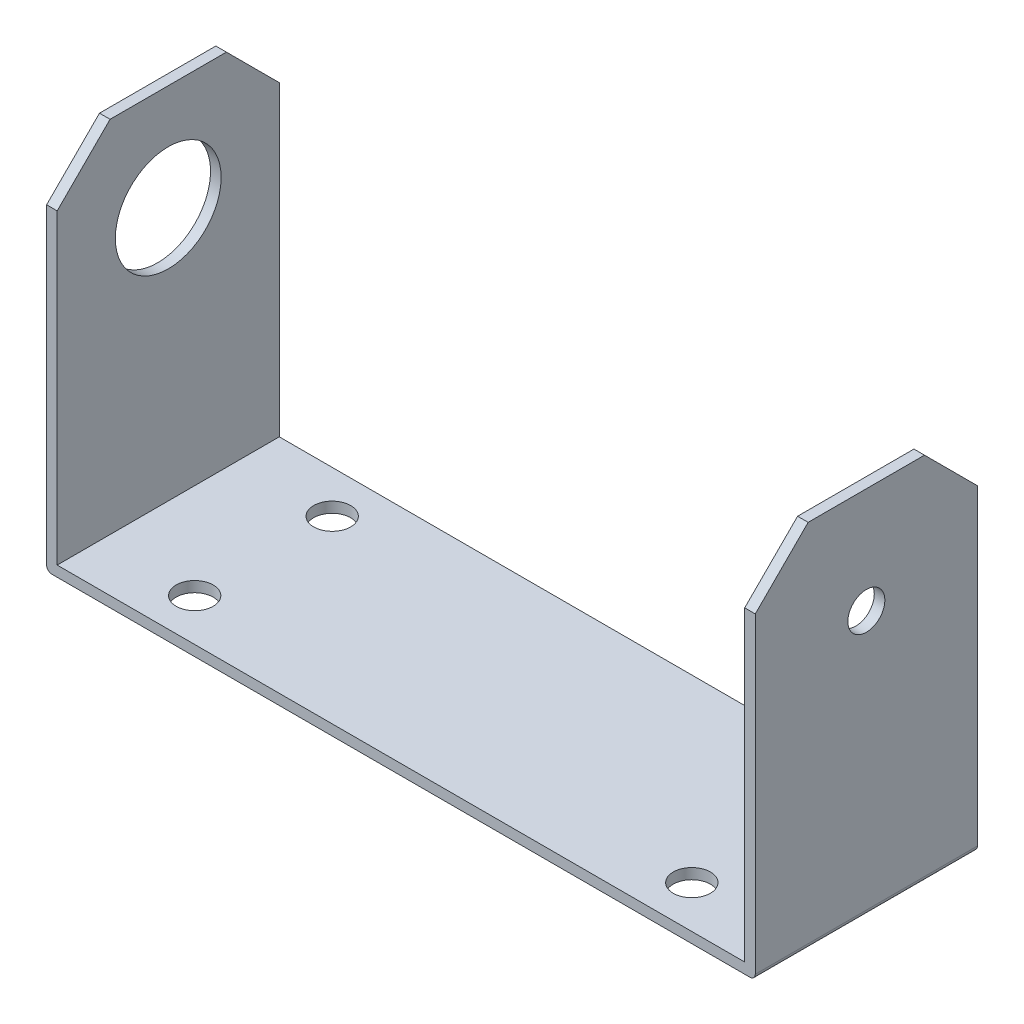
ISO-10303-21;
HEADER;
FILE_DESCRIPTION(('STEP AP214'),'2;1');
FILE_NAME('part.step','',(''),(''),'','','');
FILE_SCHEMA(('AUTOMOTIVE_DESIGN { 1 0 10303 214 1 1 1 1 }'));
ENDSEC;
DATA;
#1=APPLICATION_CONTEXT('core data for automotive mechanical design processes');
#2=APPLICATION_PROTOCOL_DEFINITION('international standard','automotive_design',2000,#1);
#3=PRODUCT_CONTEXT('',#1,'mechanical');
#4=PRODUCT('Part','Part','',(#3));
#5=PRODUCT_RELATED_PRODUCT_CATEGORY('part','',(#4));
#6=PRODUCT_DEFINITION_FORMATION('','',#4);
#7=PRODUCT_DEFINITION_CONTEXT('part definition',#1,'design');
#8=PRODUCT_DEFINITION('design','',#6,#7);
#9=PRODUCT_DEFINITION_SHAPE('','',#8);
#10=(LENGTH_UNIT() NAMED_UNIT(*) SI_UNIT(.MILLI.,.METRE.));
#11=(NAMED_UNIT(*) PLANE_ANGLE_UNIT() SI_UNIT($,.RADIAN.));
#12=(NAMED_UNIT(*) SI_UNIT($,.STERADIAN.) SOLID_ANGLE_UNIT());
#13=UNCERTAINTY_MEASURE_WITH_UNIT(LENGTH_MEASURE(1.E-05),#10,'distance_accuracy_value','');
#14=(GEOMETRIC_REPRESENTATION_CONTEXT(3) GLOBAL_UNCERTAINTY_ASSIGNED_CONTEXT((#13)) GLOBAL_UNIT_ASSIGNED_CONTEXT((#10,
#11,#12)) REPRESENTATION_CONTEXT('',''));
#15=CARTESIAN_POINT('',(0.,0.,0.));
#16=DIRECTION('',(0.,0.,1.));
#17=DIRECTION('',(1.,0.,0.));
#18=AXIS2_PLACEMENT_3D('',#15,#16,#17);
#19=CARTESIAN_POINT('',(0.,35.,0.));
#20=DIRECTION('',(0.,-1.,0.));
#21=DIRECTION('',(0.,0.,-1.));
#22=AXIS2_PLACEMENT_3D('',#19,#20,#21);
#23=PLANE('',#22);
#24=DIRECTION('',(0.,0.,-1.));
#25=VECTOR('',#24,1.);
#26=CARTESIAN_POINT('',(0.,35.,-21.));
#27=LINE('',#26,#25);
#28=CARTESIAN_POINT('',(0.,35.,-5.00000000000002));
#29=VERTEX_POINT('',#28);
#30=CARTESIAN_POINT('',(0.,35.,-16.));
#31=VERTEX_POINT('',#30);
#32=EDGE_CURVE('E178',#29,#31,#27,.T.);
#33=ORIENTED_EDGE('',*,*,#32,.T.);
#34=DIRECTION('',(-1.,0.,0.));
#35=VECTOR('',#34,1.);
#36=CARTESIAN_POINT('',(0.,35.,-16.));
#37=LINE('',#36,#35);
#38=CARTESIAN_POINT('',(-1.,35.,-16.));
#39=VERTEX_POINT('',#38);
#40=EDGE_CURVE('E219',#31,#39,#37,.T.);
#41=ORIENTED_EDGE('',*,*,#40,.T.);
#42=DIRECTION('',(0.,0.,-1.));
#43=VECTOR('',#42,1.);
#44=CARTESIAN_POINT('',(-1.,35.,0.));
#45=LINE('',#44,#43);
#46=CARTESIAN_POINT('',(-1.,35.,-5.00000000000002));
#47=VERTEX_POINT('',#46);
#48=EDGE_CURVE('E173',#47,#39,#45,.T.);
#49=ORIENTED_EDGE('',*,*,#48,.F.);
#50=DIRECTION('',(1.,0.,0.));
#51=VECTOR('',#50,1.);
#52=CARTESIAN_POINT('',(0.,35.,-5.00000000000002));
#53=LINE('',#52,#51);
#54=EDGE_CURVE('E216',#47,#29,#53,.T.);
#55=ORIENTED_EDGE('',*,*,#54,.T.);
#56=EDGE_LOOP('',(#33,#41,#49,#55));
#57=FACE_BOUND('',#56,.T.);
#58=ADVANCED_FACE('F34',(#57),#23,.F.);
#59=DIRECTION('',(0.,0.,1.));
#60=VECTOR('',#59,1.);
#61=CARTESIAN_POINT('',(-66.,35.,0.));
#62=LINE('',#61,#60);
#63=CARTESIAN_POINT('',(-66.,35.,-16.));
#64=VERTEX_POINT('',#63);
#65=CARTESIAN_POINT('',(-66.,35.,-5.00000000000002));
#66=VERTEX_POINT('',#65);
#67=EDGE_CURVE('E169',#64,#66,#62,.T.);
#68=ORIENTED_EDGE('',*,*,#67,.F.);
#69=DIRECTION('',(-1.,0.,0.));
#70=VECTOR('',#69,1.);
#71=CARTESIAN_POINT('',(0.,35.,-16.));
#72=LINE('',#71,#70);
#73=CARTESIAN_POINT('',(-67.,35.,-16.));
#74=VERTEX_POINT('',#73);
#75=EDGE_CURVE('E240',#64,#74,#72,.T.);
#76=ORIENTED_EDGE('',*,*,#75,.T.);
#77=DIRECTION('',(0.,0.,1.));
#78=VECTOR('',#77,1.);
#79=CARTESIAN_POINT('',(-67.,35.,0.));
#80=LINE('',#79,#78);
#81=CARTESIAN_POINT('',(-67.,35.,-5.00000000000002));
#82=VERTEX_POINT('',#81);
#83=EDGE_CURVE('E181',#74,#82,#80,.T.);
#84=ORIENTED_EDGE('',*,*,#83,.T.);
#85=DIRECTION('',(1.,0.,0.));
#86=VECTOR('',#85,1.);
#87=CARTESIAN_POINT('',(0.,35.,-5.00000000000002));
#88=LINE('',#87,#86);
#89=EDGE_CURVE('E237',#82,#66,#88,.T.);
#90=ORIENTED_EDGE('',*,*,#89,.T.);
#91=EDGE_LOOP('',(#68,#76,#84,#90));
#92=FACE_BOUND('',#91,.T.);
#93=ADVANCED_FACE('F254',(#92),#23,.F.);
#94=CARTESIAN_POINT('',(0.,35.,-21.));
#95=DIRECTION('',(-1.,0.,0.));
#96=DIRECTION('',(0.,0.,1.));
#97=AXIS2_PLACEMENT_3D('',#94,#95,#96);
#98=PLANE('',#97);
#99=CARTESIAN_POINT('',(0.,25.,-10.5));
#100=DIRECTION('',(1.,0.,0.));
#101=DIRECTION('',(0.,0.,-1.));
#102=AXIS2_PLACEMENT_3D('',#99,#100,#101);
#103=CIRCLE('',#102,1.75);
#104=CARTESIAN_POINT('',(0.,25.,-12.25));
#105=VERTEX_POINT('',#104);
#106=EDGE_CURVE('E456',#105,#105,#103,.T.);
#107=ORIENTED_EDGE('',*,*,#106,.F.);
#108=EDGE_LOOP('',(#107));
#109=FACE_BOUND('',#108,.T.);
#110=DIRECTION('',(0.,-1.,0.));
#111=VECTOR('',#110,1.);
#112=CARTESIAN_POINT('',(0.,35.,-21.));
#113=LINE('',#112,#111);
#114=CARTESIAN_POINT('',(0.,30.,-21.));
#115=VERTEX_POINT('',#114);
#116=CARTESIAN_POINT('',(0.,0.5,-21.));
#117=VERTEX_POINT('',#116);
#118=EDGE_CURVE('E194',#115,#117,#113,.T.);
#119=ORIENTED_EDGE('',*,*,#118,.F.);
#120=DIRECTION('',(0.,-0.707106781186548,-0.707106781186547));
#121=VECTOR('',#120,1.);
#122=CARTESIAN_POINT('',(0.,35.,-16.));
#123=LINE('',#122,#121);
#124=EDGE_CURVE('E231',#115,#31,#123,.F.);
#125=ORIENTED_EDGE('',*,*,#124,.T.);
#126=ORIENTED_EDGE('',*,*,#32,.F.);
#127=DIRECTION('',(0.,0.707106781186547,-0.707106781186548));
#128=VECTOR('',#127,1.);
#129=CARTESIAN_POINT('',(0.,35.,-5.00000000000002));
#130=LINE('',#129,#128);
#131=CARTESIAN_POINT('',(0.,30.,0.));
#132=VERTEX_POINT('',#131);
#133=EDGE_CURVE('E229',#29,#132,#130,.F.);
#134=ORIENTED_EDGE('',*,*,#133,.T.);
#135=DIRECTION('',(0.,-1.,0.));
#136=VECTOR('',#135,1.);
#137=CARTESIAN_POINT('',(0.,35.,0.));
#138=LINE('',#137,#136);
#139=CARTESIAN_POINT('',(0.,0.5,0.));
#140=VERTEX_POINT('',#139);
#141=EDGE_CURVE('E184',#132,#140,#138,.T.);
#142=ORIENTED_EDGE('',*,*,#141,.T.);
#143=DIRECTION('',(0.,0.,-1.));
#144=VECTOR('',#143,1.);
#145=CARTESIAN_POINT('',(0.,0.5,-21.));
#146=LINE('',#145,#144);
#147=EDGE_CURVE('E196',#140,#117,#146,.T.);
#148=ORIENTED_EDGE('',*,*,#147,.T.);
#149=EDGE_LOOP('',(#119,#125,#126,#134,#142,#148));
#150=FACE_BOUND('',#149,.T.);
#151=ADVANCED_FACE('F277',(#109,#150),#98,.F.);
#152=CARTESIAN_POINT('',(-67.,35.,-21.));
#153=DIRECTION('',(0.,0.,1.));
#154=DIRECTION('',(1.,0.,0.));
#155=AXIS2_PLACEMENT_3D('',#152,#153,#154);
#156=PLANE('',#155);
#157=DIRECTION('',(0.,-1.,0.));
#158=VECTOR('',#157,1.);
#159=CARTESIAN_POINT('',(-1.,35.,-21.));
#160=LINE('',#159,#158);
#161=CARTESIAN_POINT('',(-1.,30.,-21.));
#162=VERTEX_POINT('',#161);
#163=CARTESIAN_POINT('',(-1.,1.,-21.));
#164=VERTEX_POINT('',#163);
#165=EDGE_CURVE('E137',#162,#164,#160,.T.);
#166=ORIENTED_EDGE('',*,*,#165,.F.);
#167=DIRECTION('',(1.,0.,0.));
#168=VECTOR('',#167,1.);
#169=CARTESIAN_POINT('',(-67.,30.,-21.));
#170=LINE('',#169,#168);
#171=EDGE_CURVE('E227',#162,#115,#170,.T.);
#172=ORIENTED_EDGE('',*,*,#171,.T.);
#173=ORIENTED_EDGE('',*,*,#118,.T.);
#174=CARTESIAN_POINT('',(-0.5,0.5,-21.));
#175=DIRECTION('',(0.,0.,1.));
#176=DIRECTION('',(1.,0.,0.));
#177=AXIS2_PLACEMENT_3D('',#174,#175,#176);
#178=CIRCLE('',#177,0.5);
#179=CARTESIAN_POINT('',(-0.5,0.,-21.));
#180=VERTEX_POINT('',#179);
#181=EDGE_CURVE('E202',#117,#180,#178,.F.);
#182=ORIENTED_EDGE('',*,*,#181,.T.);
#183=DIRECTION('',(-1.,0.,0.));
#184=VECTOR('',#183,1.);
#185=CARTESIAN_POINT('',(-67.,0.,-21.));
#186=LINE('',#185,#184);
#187=CARTESIAN_POINT('',(-66.5,0.,-21.));
#188=VERTEX_POINT('',#187);
#189=EDGE_CURVE('E147',#180,#188,#186,.T.);
#190=ORIENTED_EDGE('',*,*,#189,.T.);
#191=CARTESIAN_POINT('',(-66.5,0.5,-21.));
#192=DIRECTION('',(0.,0.,1.));
#193=DIRECTION('',(1.,0.,0.));
#194=AXIS2_PLACEMENT_3D('',#191,#192,#193);
#195=CIRCLE('',#194,0.5);
#196=CARTESIAN_POINT('',(-67.,0.5,-21.));
#197=VERTEX_POINT('',#196);
#198=EDGE_CURVE('E199',#188,#197,#195,.F.);
#199=ORIENTED_EDGE('',*,*,#198,.T.);
#200=DIRECTION('',(0.,-1.,0.));
#201=VECTOR('',#200,1.);
#202=CARTESIAN_POINT('',(-67.,35.,-21.));
#203=LINE('',#202,#201);
#204=CARTESIAN_POINT('',(-67.,30.,-21.));
#205=VERTEX_POINT('',#204);
#206=EDGE_CURVE('E192',#205,#197,#203,.T.);
#207=ORIENTED_EDGE('',*,*,#206,.F.);
#208=DIRECTION('',(1.,0.,0.));
#209=VECTOR('',#208,1.);
#210=CARTESIAN_POINT('',(-67.,30.,-21.));
#211=LINE('',#210,#209);
#212=CARTESIAN_POINT('',(-66.,30.,-21.));
#213=VERTEX_POINT('',#212);
#214=EDGE_CURVE('E225',#205,#213,#211,.T.);
#215=ORIENTED_EDGE('',*,*,#214,.T.);
#216=DIRECTION('',(0.,-1.,0.));
#217=VECTOR('',#216,1.);
#218=CARTESIAN_POINT('',(-66.,35.,-21.));
#219=LINE('',#218,#217);
#220=CARTESIAN_POINT('',(-66.,1.,-21.));
#221=VERTEX_POINT('',#220);
#222=EDGE_CURVE('E148',#213,#221,#219,.T.);
#223=ORIENTED_EDGE('',*,*,#222,.T.);
#224=DIRECTION('',(-1.,0.,0.));
#225=VECTOR('',#224,1.);
#226=CARTESIAN_POINT('',(0.,1.,-21.));
#227=LINE('',#226,#225);
#228=EDGE_CURVE('E155',#164,#221,#227,.T.);
#229=ORIENTED_EDGE('',*,*,#228,.F.);
#230=EDGE_LOOP('',(#166,#172,#173,#182,#190,#199,#207,#215,#223,#229));
#231=FACE_BOUND('',#230,.T.);
#232=ADVANCED_FACE('F161',(#231),#156,.F.);
#233=CARTESIAN_POINT('',(-67.,35.,0.));
#234=DIRECTION('',(1.,0.,0.));
#235=DIRECTION('',(0.,0.,-1.));
#236=AXIS2_PLACEMENT_3D('',#233,#234,#235);
#237=PLANE('',#236);
#238=CARTESIAN_POINT('',(-67.,25.,-10.5));
#239=DIRECTION('',(-1.,0.,0.));
#240=DIRECTION('',(0.,0.,1.));
#241=AXIS2_PLACEMENT_3D('',#238,#239,#240);
#242=CIRCLE('',#241,4.99999999999999);
#243=CARTESIAN_POINT('',(-67.,25.,-5.50000000000001));
#244=VERTEX_POINT('',#243);
#245=EDGE_CURVE('E460',#244,#244,#242,.T.);
#246=ORIENTED_EDGE('',*,*,#245,.F.);
#247=EDGE_LOOP('',(#246));
#248=FACE_BOUND('',#247,.T.);
#249=ORIENTED_EDGE('',*,*,#83,.F.);
#250=DIRECTION('',(0.,0.707106781186548,0.707106781186547));
#251=VECTOR('',#250,1.);
#252=CARTESIAN_POINT('',(-67.,35.,-16.));
#253=LINE('',#252,#251);
#254=EDGE_CURVE('E57',#74,#205,#253,.F.);
#255=ORIENTED_EDGE('',*,*,#254,.T.);
#256=ORIENTED_EDGE('',*,*,#206,.T.);
#257=DIRECTION('',(0.,0.,1.));
#258=VECTOR('',#257,1.);
#259=CARTESIAN_POINT('',(-67.,0.5,0.));
#260=LINE('',#259,#258);
#261=CARTESIAN_POINT('',(-67.,0.5,0.));
#262=VERTEX_POINT('',#261);
#263=EDGE_CURVE('E213',#197,#262,#260,.T.);
#264=ORIENTED_EDGE('',*,*,#263,.T.);
#265=DIRECTION('',(0.,-1.,0.));
#266=VECTOR('',#265,1.);
#267=CARTESIAN_POINT('',(-67.,35.,0.));
#268=LINE('',#267,#266);
#269=CARTESIAN_POINT('',(-67.,30.,0.));
#270=VERTEX_POINT('',#269);
#271=EDGE_CURVE('E190',#270,#262,#268,.T.);
#272=ORIENTED_EDGE('',*,*,#271,.F.);
#273=DIRECTION('',(0.,-0.707106781186547,0.707106781186548));
#274=VECTOR('',#273,1.);
#275=CARTESIAN_POINT('',(-67.,35.,-5.00000000000002));
#276=LINE('',#275,#274);
#277=EDGE_CURVE('E49',#270,#82,#276,.F.);
#278=ORIENTED_EDGE('',*,*,#277,.T.);
#279=EDGE_LOOP('',(#249,#255,#256,#264,#272,#278));
#280=FACE_BOUND('',#279,.T.);
#281=ADVANCED_FACE('F255',(#248,#280),#237,.F.);
#282=CARTESIAN_POINT('',(0.,35.,0.));
#283=DIRECTION('',(0.,0.,-1.));
#284=DIRECTION('',(-1.,0.,0.));
#285=AXIS2_PLACEMENT_3D('',#282,#283,#284);
#286=PLANE('',#285);
#287=ORIENTED_EDGE('',*,*,#141,.F.);
#288=DIRECTION('',(-1.,0.,0.));
#289=VECTOR('',#288,1.);
#290=CARTESIAN_POINT('',(0.,30.,0.));
#291=LINE('',#290,#289);
#292=CARTESIAN_POINT('',(-1.,30.,0.));
#293=VERTEX_POINT('',#292);
#294=EDGE_CURVE('E235',#132,#293,#291,.T.);
#295=ORIENTED_EDGE('',*,*,#294,.T.);
#296=DIRECTION('',(0.,-1.,0.));
#297=VECTOR('',#296,1.);
#298=CARTESIAN_POINT('',(-1.,35.,0.));
#299=LINE('',#298,#297);
#300=CARTESIAN_POINT('',(-1.,1.,0.));
#301=VERTEX_POINT('',#300);
#302=EDGE_CURVE('E172',#293,#301,#299,.T.);
#303=ORIENTED_EDGE('',*,*,#302,.T.);
#304=DIRECTION('',(1.,0.,0.));
#305=VECTOR('',#304,1.);
#306=CARTESIAN_POINT('',(0.,1.,0.));
#307=LINE('',#306,#305);
#308=CARTESIAN_POINT('',(-66.,1.,0.));
#309=VERTEX_POINT('',#308);
#310=EDGE_CURVE('E158',#309,#301,#307,.T.);
#311=ORIENTED_EDGE('',*,*,#310,.F.);
#312=DIRECTION('',(0.,-1.,0.));
#313=VECTOR('',#312,1.);
#314=CARTESIAN_POINT('',(-66.,35.,0.));
#315=LINE('',#314,#313);
#316=CARTESIAN_POINT('',(-66.,30.,0.));
#317=VERTEX_POINT('',#316);
#318=EDGE_CURVE('E168',#317,#309,#315,.T.);
#319=ORIENTED_EDGE('',*,*,#318,.F.);
#320=DIRECTION('',(-1.,0.,0.));
#321=VECTOR('',#320,1.);
#322=CARTESIAN_POINT('',(0.,30.,0.));
#323=LINE('',#322,#321);
#324=EDGE_CURVE('E233',#317,#270,#323,.T.);
#325=ORIENTED_EDGE('',*,*,#324,.T.);
#326=ORIENTED_EDGE('',*,*,#271,.T.);
#327=CARTESIAN_POINT('',(-66.5,0.5,0.));
#328=DIRECTION('',(0.,0.,-1.));
#329=DIRECTION('',(-1.,0.,0.));
#330=AXIS2_PLACEMENT_3D('',#327,#328,#329);
#331=CIRCLE('',#330,0.5);
#332=CARTESIAN_POINT('',(-66.5,0.,0.));
#333=VERTEX_POINT('',#332);
#334=EDGE_CURVE('E208',#262,#333,#331,.F.);
#335=ORIENTED_EDGE('',*,*,#334,.T.);
#336=DIRECTION('',(1.,0.,0.));
#337=VECTOR('',#336,1.);
#338=CARTESIAN_POINT('',(0.,0.,0.));
#339=LINE('',#338,#337);
#340=CARTESIAN_POINT('',(-0.5,0.,0.));
#341=VERTEX_POINT('',#340);
#342=EDGE_CURVE('E182',#333,#341,#339,.T.);
#343=ORIENTED_EDGE('',*,*,#342,.T.);
#344=CARTESIAN_POINT('',(-0.5,0.5,0.));
#345=DIRECTION('',(0.,0.,-1.));
#346=DIRECTION('',(-1.,0.,0.));
#347=AXIS2_PLACEMENT_3D('',#344,#345,#346);
#348=CIRCLE('',#347,0.5);
#349=EDGE_CURVE('E210',#341,#140,#348,.F.);
#350=ORIENTED_EDGE('',*,*,#349,.T.);
#351=EDGE_LOOP('',(#287,#295,#303,#311,#319,#325,#326,#335,#343,#350));
#352=FACE_BOUND('',#351,.T.);
#353=ADVANCED_FACE('F252',(#352),#286,.F.);
#354=CARTESIAN_POINT('',(0.,0.,0.));
#355=DIRECTION('',(0.,-1.,0.));
#356=DIRECTION('',(0.,0.,-1.));
#357=AXIS2_PLACEMENT_3D('',#354,#355,#356);
#358=PLANE('',#357);
#359=CARTESIAN_POINT('',(-57.,0.,-17.));
#360=DIRECTION('',(0.,1.,0.));
#361=DIRECTION('',(0.,0.,1.));
#362=AXIS2_PLACEMENT_3D('',#359,#360,#361);
#363=CIRCLE('',#362,1.75);
#364=CARTESIAN_POINT('',(-57.,0.,-15.25));
#365=VERTEX_POINT('',#364);
#366=EDGE_CURVE('E472',#365,#365,#363,.T.);
#367=ORIENTED_EDGE('',*,*,#366,.T.);
#368=EDGE_LOOP('',(#367));
#369=FACE_BOUND('',#368,.T.);
#370=CARTESIAN_POINT('',(-10.,0.,-17.));
#371=DIRECTION('',(0.,1.,0.));
#372=DIRECTION('',(0.,0.,1.));
#373=AXIS2_PLACEMENT_3D('',#370,#371,#372);
#374=CIRCLE('',#373,1.75);
#375=CARTESIAN_POINT('',(-10.,0.,-15.25));
#376=VERTEX_POINT('',#375);
#377=EDGE_CURVE('E478',#376,#376,#374,.T.);
#378=ORIENTED_EDGE('',*,*,#377,.T.);
#379=EDGE_LOOP('',(#378));
#380=FACE_BOUND('',#379,.T.);
#381=CARTESIAN_POINT('',(-10.,0.,-4.));
#382=DIRECTION('',(0.,1.,0.));
#383=DIRECTION('',(0.,0.,1.));
#384=AXIS2_PLACEMENT_3D('',#381,#382,#383);
#385=CIRCLE('',#384,1.75);
#386=CARTESIAN_POINT('',(-10.,0.,-2.25));
#387=VERTEX_POINT('',#386);
#388=EDGE_CURVE('E484',#387,#387,#385,.T.);
#389=ORIENTED_EDGE('',*,*,#388,.T.);
#390=EDGE_LOOP('',(#389));
#391=FACE_BOUND('',#390,.T.);
#392=CARTESIAN_POINT('',(-57.,0.,-4.));
#393=DIRECTION('',(0.,1.,0.));
#394=DIRECTION('',(0.,0.,1.));
#395=AXIS2_PLACEMENT_3D('',#392,#393,#394);
#396=CIRCLE('',#395,1.75);
#397=CARTESIAN_POINT('',(-57.,0.,-2.25));
#398=VERTEX_POINT('',#397);
#399=EDGE_CURVE('E159',#398,#398,#396,.T.);
#400=ORIENTED_EDGE('',*,*,#399,.T.);
#401=EDGE_LOOP('',(#400));
#402=FACE_BOUND('',#401,.T.);
#403=ORIENTED_EDGE('',*,*,#189,.F.);
#404=DIRECTION('',(0.,0.,-1.));
#405=VECTOR('',#404,1.);
#406=CARTESIAN_POINT('',(-0.5,0.,0.));
#407=LINE('',#406,#405);
#408=EDGE_CURVE('E206',#180,#341,#407,.F.);
#409=ORIENTED_EDGE('',*,*,#408,.T.);
#410=ORIENTED_EDGE('',*,*,#342,.F.);
#411=DIRECTION('',(0.,0.,1.));
#412=VECTOR('',#411,1.);
#413=CARTESIAN_POINT('',(-66.5,0.,-21.));
#414=LINE('',#413,#412);
#415=EDGE_CURVE('E204',#333,#188,#414,.F.);
#416=ORIENTED_EDGE('',*,*,#415,.T.);
#417=EDGE_LOOP('',(#403,#409,#410,#416));
#418=FACE_BOUND('',#417,.T.);
#419=ADVANCED_FACE('F281',(#369,#380,#391,#402,#418),#358,.T.);
#420=CARTESIAN_POINT('',(-1.,35.,-21.));
#421=DIRECTION('',(-1.,0.,0.));
#422=DIRECTION('',(0.,0.,1.));
#423=AXIS2_PLACEMENT_3D('',#420,#421,#422);
#424=PLANE('',#423);
#425=CARTESIAN_POINT('',(-1.,25.,-10.5));
#426=DIRECTION('',(-1.,0.,0.));
#427=DIRECTION('',(0.,0.,1.));
#428=AXIS2_PLACEMENT_3D('',#425,#426,#427);
#429=CIRCLE('',#428,1.75);
#430=CARTESIAN_POINT('',(-1.,25.,-8.75));
#431=VERTEX_POINT('',#430);
#432=EDGE_CURVE('E459',#431,#431,#429,.T.);
#433=ORIENTED_EDGE('',*,*,#432,.F.);
#434=EDGE_LOOP('',(#433));
#435=FACE_BOUND('',#434,.T.);
#436=ORIENTED_EDGE('',*,*,#48,.T.);
#437=DIRECTION('',(0.,0.707106781186548,0.707106781186547));
#438=VECTOR('',#437,1.);
#439=CARTESIAN_POINT('',(-1.,32.5,-18.5));
#440=LINE('',#439,#438);
#441=EDGE_CURVE('E143',#39,#162,#440,.F.);
#442=ORIENTED_EDGE('',*,*,#441,.T.);
#443=ORIENTED_EDGE('',*,*,#165,.T.);
#444=DIRECTION('',(0.,0.,-1.));
#445=VECTOR('',#444,1.);
#446=CARTESIAN_POINT('',(-1.,1.,0.));
#447=LINE('',#446,#445);
#448=EDGE_CURVE('E142',#301,#164,#447,.T.);
#449=ORIENTED_EDGE('',*,*,#448,.F.);
#450=ORIENTED_EDGE('',*,*,#302,.F.);
#451=DIRECTION('',(0.,-0.707106781186547,0.707106781186548));
#452=VECTOR('',#451,1.);
#453=CARTESIAN_POINT('',(-1.,43.,-13.));
#454=LINE('',#453,#452);
#455=EDGE_CURVE('E222',#293,#47,#454,.F.);
#456=ORIENTED_EDGE('',*,*,#455,.T.);
#457=EDGE_LOOP('',(#436,#442,#443,#449,#450,#456));
#458=FACE_BOUND('',#457,.T.);
#459=ADVANCED_FACE('F140',(#435,#458),#424,.T.);
#460=CARTESIAN_POINT('',(-66.,35.,0.));
#461=DIRECTION('',(1.,0.,0.));
#462=DIRECTION('',(0.,0.,-1.));
#463=AXIS2_PLACEMENT_3D('',#460,#461,#462);
#464=PLANE('',#463);
#465=CARTESIAN_POINT('',(-66.,25.,-10.5));
#466=DIRECTION('',(1.,0.,0.));
#467=DIRECTION('',(0.,0.,-1.));
#468=AXIS2_PLACEMENT_3D('',#465,#466,#467);
#469=CIRCLE('',#468,5.);
#470=CARTESIAN_POINT('',(-66.,25.,-15.5));
#471=VERTEX_POINT('',#470);
#472=EDGE_CURVE('E463',#471,#471,#469,.T.);
#473=ORIENTED_EDGE('',*,*,#472,.F.);
#474=EDGE_LOOP('',(#473));
#475=FACE_BOUND('',#474,.T.);
#476=ORIENTED_EDGE('',*,*,#222,.F.);
#477=DIRECTION('',(0.,-0.707106781186548,-0.707106781186547));
#478=VECTOR('',#477,1.);
#479=CARTESIAN_POINT('',(-66.,43.,-8.));
#480=LINE('',#479,#478);
#481=EDGE_CURVE('E11',#213,#64,#480,.F.);
#482=ORIENTED_EDGE('',*,*,#481,.T.);
#483=ORIENTED_EDGE('',*,*,#67,.T.);
#484=DIRECTION('',(0.,0.707106781186547,-0.707106781186548));
#485=VECTOR('',#484,1.);
#486=CARTESIAN_POINT('',(-66.,32.5,-2.50000000000001));
#487=LINE('',#486,#485);
#488=EDGE_CURVE('E42',#66,#317,#487,.F.);
#489=ORIENTED_EDGE('',*,*,#488,.T.);
#490=ORIENTED_EDGE('',*,*,#318,.T.);
#491=DIRECTION('',(0.,0.,1.));
#492=VECTOR('',#491,1.);
#493=CARTESIAN_POINT('',(-66.,1.,0.));
#494=LINE('',#493,#492);
#495=EDGE_CURVE('E163',#221,#309,#494,.T.);
#496=ORIENTED_EDGE('',*,*,#495,.F.);
#497=EDGE_LOOP('',(#476,#482,#483,#489,#490,#496));
#498=FACE_BOUND('',#497,.T.);
#499=ADVANCED_FACE('F245',(#475,#498),#464,.T.);
#500=CARTESIAN_POINT('',(0.,1.,0.));
#501=DIRECTION('',(0.,-1.,0.));
#502=DIRECTION('',(0.,0.,-1.));
#503=AXIS2_PLACEMENT_3D('',#500,#501,#502);
#504=PLANE('',#503);
#505=CARTESIAN_POINT('',(-57.,1.,-17.));
#506=DIRECTION('',(0.,1.,0.));
#507=DIRECTION('',(0.,0.,1.));
#508=AXIS2_PLACEMENT_3D('',#505,#506,#507);
#509=CIRCLE('',#508,1.75);
#510=CARTESIAN_POINT('',(-57.,1.,-15.25));
#511=VERTEX_POINT('',#510);
#512=EDGE_CURVE('E469',#511,#511,#509,.T.);
#513=ORIENTED_EDGE('',*,*,#512,.F.);
#514=EDGE_LOOP('',(#513));
#515=FACE_BOUND('',#514,.T.);
#516=CARTESIAN_POINT('',(-10.,1.,-17.));
#517=DIRECTION('',(0.,1.,0.));
#518=DIRECTION('',(0.,0.,1.));
#519=AXIS2_PLACEMENT_3D('',#516,#517,#518);
#520=CIRCLE('',#519,1.75);
#521=CARTESIAN_POINT('',(-10.,1.,-15.25));
#522=VERTEX_POINT('',#521);
#523=EDGE_CURVE('E475',#522,#522,#520,.T.);
#524=ORIENTED_EDGE('',*,*,#523,.F.);
#525=EDGE_LOOP('',(#524));
#526=FACE_BOUND('',#525,.T.);
#527=CARTESIAN_POINT('',(-10.,1.,-4.));
#528=DIRECTION('',(0.,1.,0.));
#529=DIRECTION('',(0.,0.,1.));
#530=AXIS2_PLACEMENT_3D('',#527,#528,#529);
#531=CIRCLE('',#530,1.75);
#532=CARTESIAN_POINT('',(-10.,1.,-2.25));
#533=VERTEX_POINT('',#532);
#534=EDGE_CURVE('E481',#533,#533,#531,.T.);
#535=ORIENTED_EDGE('',*,*,#534,.F.);
#536=EDGE_LOOP('',(#535));
#537=FACE_BOUND('',#536,.T.);
#538=CARTESIAN_POINT('',(-57.,1.,-4.));
#539=DIRECTION('',(0.,1.,0.));
#540=DIRECTION('',(0.,0.,1.));
#541=AXIS2_PLACEMENT_3D('',#538,#539,#540);
#542=CIRCLE('',#541,1.75);
#543=CARTESIAN_POINT('',(-57.,1.,-2.25));
#544=VERTEX_POINT('',#543);
#545=EDGE_CURVE('E487',#544,#544,#542,.T.);
#546=ORIENTED_EDGE('',*,*,#545,.F.);
#547=EDGE_LOOP('',(#546));
#548=FACE_BOUND('',#547,.T.);
#549=ORIENTED_EDGE('',*,*,#448,.T.);
#550=ORIENTED_EDGE('',*,*,#228,.T.);
#551=ORIENTED_EDGE('',*,*,#495,.T.);
#552=ORIENTED_EDGE('',*,*,#310,.T.);
#553=EDGE_LOOP('',(#549,#550,#551,#552));
#554=FACE_BOUND('',#553,.T.);
#555=ADVANCED_FACE('F153',(#515,#526,#537,#548,#554),#504,.F.);
#556=CARTESIAN_POINT('',(-0.5,0.5,-21.));
#557=DIRECTION('',(0.,0.,1.));
#558=DIRECTION('',(1.,0.,0.));
#559=AXIS2_PLACEMENT_3D('',#556,#557,#558);
#560=CYLINDRICAL_SURFACE('',#559,0.5);
#561=ORIENTED_EDGE('',*,*,#349,.F.);
#562=ORIENTED_EDGE('',*,*,#408,.F.);
#563=ORIENTED_EDGE('',*,*,#181,.F.);
#564=ORIENTED_EDGE('',*,*,#147,.F.);
#565=EDGE_LOOP('',(#561,#562,#563,#564));
#566=FACE_BOUND('',#565,.T.);
#567=ADVANCED_FACE('F295',(#566),#560,.T.);
#568=CARTESIAN_POINT('',(-66.5,0.5,0.));
#569=DIRECTION('',(0.,0.,-1.));
#570=DIRECTION('',(-1.,0.,0.));
#571=AXIS2_PLACEMENT_3D('',#568,#569,#570);
#572=CYLINDRICAL_SURFACE('',#571,0.5);
#573=ORIENTED_EDGE('',*,*,#198,.F.);
#574=ORIENTED_EDGE('',*,*,#415,.F.);
#575=ORIENTED_EDGE('',*,*,#334,.F.);
#576=ORIENTED_EDGE('',*,*,#263,.F.);
#577=EDGE_LOOP('',(#573,#574,#575,#576));
#578=FACE_BOUND('',#577,.T.);
#579=ADVANCED_FACE('F298',(#578),#572,.T.);
#580=CARTESIAN_POINT('',(0.,35.,-16.));
#581=DIRECTION('',(0.,-0.707106781186547,0.707106781186548));
#582=DIRECTION('',(-1.,0.,0.));
#583=AXIS2_PLACEMENT_3D('',#580,#581,#582);
#584=PLANE('',#583);
#585=ORIENTED_EDGE('',*,*,#124,.F.);
#586=ORIENTED_EDGE('',*,*,#171,.F.);
#587=ORIENTED_EDGE('',*,*,#441,.F.);
#588=ORIENTED_EDGE('',*,*,#40,.F.);
#589=EDGE_LOOP('',(#585,#586,#587,#588));
#590=FACE_BOUND('',#589,.T.);
#591=ADVANCED_FACE('F268',(#590),#584,.F.);
#592=CARTESIAN_POINT('',(0.,35.,-5.00000000000002));
#593=DIRECTION('',(0.,-0.707106781186548,-0.707106781186547));
#594=DIRECTION('',(1.,0.,0.));
#595=AXIS2_PLACEMENT_3D('',#592,#593,#594);
#596=PLANE('',#595);
#597=ORIENTED_EDGE('',*,*,#455,.F.);
#598=ORIENTED_EDGE('',*,*,#294,.F.);
#599=ORIENTED_EDGE('',*,*,#133,.F.);
#600=ORIENTED_EDGE('',*,*,#54,.F.);
#601=EDGE_LOOP('',(#597,#598,#599,#600));
#602=FACE_BOUND('',#601,.T.);
#603=ADVANCED_FACE('F262',(#602),#596,.F.);
#604=CARTESIAN_POINT('',(0.,35.,-16.));
#605=DIRECTION('',(0.,-0.707106781186547,0.707106781186548));
#606=DIRECTION('',(-1.,0.,0.));
#607=AXIS2_PLACEMENT_3D('',#604,#605,#606);
#608=PLANE('',#607);
#609=ORIENTED_EDGE('',*,*,#481,.F.);
#610=ORIENTED_EDGE('',*,*,#214,.F.);
#611=ORIENTED_EDGE('',*,*,#254,.F.);
#612=ORIENTED_EDGE('',*,*,#75,.F.);
#613=EDGE_LOOP('',(#609,#610,#611,#612));
#614=FACE_BOUND('',#613,.T.);
#615=ADVANCED_FACE('F260',(#614),#608,.F.);
#616=CARTESIAN_POINT('',(0.,35.,-5.00000000000002));
#617=DIRECTION('',(0.,-0.707106781186548,-0.707106781186547));
#618=DIRECTION('',(1.,0.,0.));
#619=AXIS2_PLACEMENT_3D('',#616,#617,#618);
#620=PLANE('',#619);
#621=ORIENTED_EDGE('',*,*,#277,.F.);
#622=ORIENTED_EDGE('',*,*,#324,.F.);
#623=ORIENTED_EDGE('',*,*,#488,.F.);
#624=ORIENTED_EDGE('',*,*,#89,.F.);
#625=EDGE_LOOP('',(#621,#622,#623,#624));
#626=FACE_BOUND('',#625,.T.);
#627=ADVANCED_FACE('F36',(#626),#620,.F.);
#628=CARTESIAN_POINT('',(-57.,1.,-4.));
#629=DIRECTION('',(0.,1.,0.));
#630=DIRECTION('',(0.,0.,1.));
#631=AXIS2_PLACEMENT_3D('',#628,#629,#630);
#632=CYLINDRICAL_SURFACE('',#631,1.75);
#633=ORIENTED_EDGE('',*,*,#399,.F.);
#634=EDGE_LOOP('',(#633));
#635=FACE_BOUND('',#634,.T.);
#636=ORIENTED_EDGE('',*,*,#545,.T.);
#637=EDGE_LOOP('',(#636));
#638=FACE_BOUND('',#637,.T.);
#639=ADVANCED_FACE('F267',(#635,#638),#632,.F.);
#640=CARTESIAN_POINT('',(-10.,1.,-4.));
#641=DIRECTION('',(0.,1.,0.));
#642=DIRECTION('',(0.,0.,1.));
#643=AXIS2_PLACEMENT_3D('',#640,#641,#642);
#644=CYLINDRICAL_SURFACE('',#643,1.75);
#645=ORIENTED_EDGE('',*,*,#388,.F.);
#646=EDGE_LOOP('',(#645));
#647=FACE_BOUND('',#646,.T.);
#648=ORIENTED_EDGE('',*,*,#534,.T.);
#649=EDGE_LOOP('',(#648));
#650=FACE_BOUND('',#649,.T.);
#651=ADVANCED_FACE('F371',(#647,#650),#644,.F.);
#652=CARTESIAN_POINT('',(-10.,1.,-17.));
#653=DIRECTION('',(0.,1.,0.));
#654=DIRECTION('',(0.,0.,1.));
#655=AXIS2_PLACEMENT_3D('',#652,#653,#654);
#656=CYLINDRICAL_SURFACE('',#655,1.75);
#657=ORIENTED_EDGE('',*,*,#377,.F.);
#658=EDGE_LOOP('',(#657));
#659=FACE_BOUND('',#658,.T.);
#660=ORIENTED_EDGE('',*,*,#523,.T.);
#661=EDGE_LOOP('',(#660));
#662=FACE_BOUND('',#661,.T.);
#663=ADVANCED_FACE('F381',(#659,#662),#656,.F.);
#664=CARTESIAN_POINT('',(-57.,1.,-17.));
#665=DIRECTION('',(0.,1.,0.));
#666=DIRECTION('',(0.,0.,1.));
#667=AXIS2_PLACEMENT_3D('',#664,#665,#666);
#668=CYLINDRICAL_SURFACE('',#667,1.75);
#669=ORIENTED_EDGE('',*,*,#366,.F.);
#670=EDGE_LOOP('',(#669));
#671=FACE_BOUND('',#670,.T.);
#672=ORIENTED_EDGE('',*,*,#512,.T.);
#673=EDGE_LOOP('',(#672));
#674=FACE_BOUND('',#673,.T.);
#675=ADVANCED_FACE('F391',(#671,#674),#668,.F.);
#676=CARTESIAN_POINT('',(-67.,25.,-10.5));
#677=DIRECTION('',(-1.,0.,0.));
#678=DIRECTION('',(0.,0.,1.));
#679=AXIS2_PLACEMENT_3D('',#676,#677,#678);
#680=CYLINDRICAL_SURFACE('',#679,5.);
#681=ORIENTED_EDGE('',*,*,#245,.T.);
#682=EDGE_LOOP('',(#681));
#683=FACE_BOUND('',#682,.T.);
#684=ORIENTED_EDGE('',*,*,#472,.T.);
#685=EDGE_LOOP('',(#684));
#686=FACE_BOUND('',#685,.T.);
#687=ADVANCED_FACE('F401',(#683,#686),#680,.F.);
#688=CARTESIAN_POINT('',(0.,25.,-10.5));
#689=DIRECTION('',(1.,0.,0.));
#690=DIRECTION('',(0.,0.,-1.));
#691=AXIS2_PLACEMENT_3D('',#688,#689,#690);
#692=CYLINDRICAL_SURFACE('',#691,1.75);
#693=ORIENTED_EDGE('',*,*,#106,.T.);
#694=EDGE_LOOP('',(#693));
#695=FACE_BOUND('',#694,.T.);
#696=ORIENTED_EDGE('',*,*,#432,.T.);
#697=EDGE_LOOP('',(#696));
#698=FACE_BOUND('',#697,.T.);
#699=ADVANCED_FACE('F425',(#695,#698),#692,.F.);
#700=CLOSED_SHELL('',(#58,#93,#151,#232,#281,#353,#419,#459,#499,#555,#567,#579,#591,#603,#615,
#627,#639,#651,#663,#675,#687,#699));
#701=MANIFOLD_SOLID_BREP('B2',#700);
#702=ADVANCED_BREP_SHAPE_REPRESENTATION('',(#18,#701),#14);
#703=SHAPE_DEFINITION_REPRESENTATION(#9,#702);
ENDSEC;
END-ISO-10303-21;
